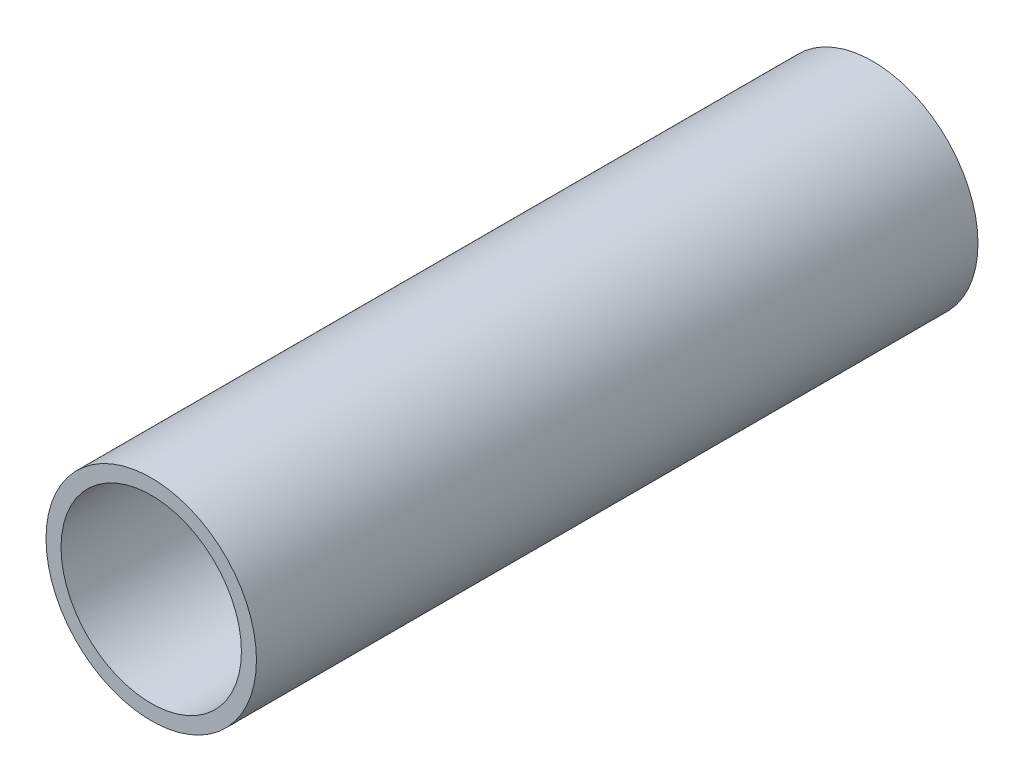
ISO-10303-21;
HEADER;
FILE_DESCRIPTION(('STEP AP214'),'2;1');
FILE_NAME('part.step','',(''),(''),'','','');
FILE_SCHEMA(('AUTOMOTIVE_DESIGN { 1 0 10303 214 1 1 1 1 }'));
ENDSEC;
DATA;
#1=APPLICATION_CONTEXT('core data for automotive mechanical design processes');
#2=APPLICATION_PROTOCOL_DEFINITION('international standard','automotive_design',2000,#1);
#3=PRODUCT_CONTEXT('',#1,'mechanical');
#4=PRODUCT('Part','Part','',(#3));
#5=PRODUCT_RELATED_PRODUCT_CATEGORY('part','',(#4));
#6=PRODUCT_DEFINITION_FORMATION('','',#4);
#7=PRODUCT_DEFINITION_CONTEXT('part definition',#1,'design');
#8=PRODUCT_DEFINITION('design','',#6,#7);
#9=PRODUCT_DEFINITION_SHAPE('','',#8);
#10=(LENGTH_UNIT() NAMED_UNIT(*) SI_UNIT(.MILLI.,.METRE.));
#11=(NAMED_UNIT(*) PLANE_ANGLE_UNIT() SI_UNIT($,.RADIAN.));
#12=(NAMED_UNIT(*) SI_UNIT($,.STERADIAN.) SOLID_ANGLE_UNIT());
#13=UNCERTAINTY_MEASURE_WITH_UNIT(LENGTH_MEASURE(1.E-05),#10,'distance_accuracy_value','');
#14=(GEOMETRIC_REPRESENTATION_CONTEXT(3) GLOBAL_UNCERTAINTY_ASSIGNED_CONTEXT((#13)) GLOBAL_UNIT_ASSIGNED_CONTEXT((#10,
#11,#12)) REPRESENTATION_CONTEXT('',''));
#15=CARTESIAN_POINT('',(0.,0.,0.));
#16=DIRECTION('',(0.,0.,1.));
#17=DIRECTION('',(1.,0.,0.));
#18=AXIS2_PLACEMENT_3D('',#15,#16,#17);
#19=CARTESIAN_POINT('',(0.,0.,152.4));
#20=DIRECTION('',(0.,0.,-1.));
#21=DIRECTION('',(-1.,0.,0.));
#22=AXIS2_PLACEMENT_3D('',#19,#20,#21);
#23=CYLINDRICAL_SURFACE('',#22,22.225);
#24=CARTESIAN_POINT('',(0.,0.,152.4));
#25=DIRECTION('',(0.,0.,1.));
#26=DIRECTION('',(1.,0.,0.));
#27=AXIS2_PLACEMENT_3D('',#24,#25,#26);
#28=CIRCLE('',#27,22.225);
#29=CARTESIAN_POINT('',(-22.225,0.,152.4));
#30=VERTEX_POINT('',#29);
#31=EDGE_CURVE('E10',#30,#30,#28,.T.);
#32=CARTESIAN_POINT('',(0.,0.,0.));
#33=DIRECTION('',(0.,0.,1.));
#34=DIRECTION('',(1.,0.,0.));
#35=AXIS2_PLACEMENT_3D('',#32,#33,#34);
#36=CIRCLE('',#35,22.225);
#37=CARTESIAN_POINT('',(-22.225,0.,0.));
#38=VERTEX_POINT('',#37);
#39=EDGE_CURVE('E40',#38,#38,#36,.T.);
#40=CARTESIAN_POINT('',(-22.225,0.,152.4));
#41=CARTESIAN_POINT('',(-22.225,0.,150.8125));
#42=CARTESIAN_POINT('',(-22.225,0.,149.225));
#43=CARTESIAN_POINT('',(-22.225,0.,146.05));
#44=CARTESIAN_POINT('',(-22.225,0.,144.4625));
#45=CARTESIAN_POINT('',(-22.225,0.,141.2875));
#46=CARTESIAN_POINT('',(-22.225,0.,139.7));
#47=CARTESIAN_POINT('',(-22.225,0.,136.525));
#48=CARTESIAN_POINT('',(-22.225,0.,134.9375));
#49=CARTESIAN_POINT('',(-22.225,0.,131.7625));
#50=CARTESIAN_POINT('',(-22.225,0.,130.175));
#51=CARTESIAN_POINT('',(-22.225,0.,127.));
#52=CARTESIAN_POINT('',(-22.225,0.,125.4125));
#53=CARTESIAN_POINT('',(-22.225,0.,122.2375));
#54=CARTESIAN_POINT('',(-22.225,0.,120.65));
#55=CARTESIAN_POINT('',(-22.225,0.,117.475));
#56=CARTESIAN_POINT('',(-22.225,0.,115.8875));
#57=CARTESIAN_POINT('',(-22.225,0.,112.7125));
#58=CARTESIAN_POINT('',(-22.225,0.,111.125));
#59=CARTESIAN_POINT('',(-22.225,0.,107.95));
#60=CARTESIAN_POINT('',(-22.225,0.,106.3625));
#61=CARTESIAN_POINT('',(-22.225,0.,103.1875));
#62=CARTESIAN_POINT('',(-22.225,0.,101.6));
#63=CARTESIAN_POINT('',(-22.225,0.,98.425));
#64=CARTESIAN_POINT('',(-22.225,0.,96.8375));
#65=CARTESIAN_POINT('',(-22.225,0.,93.6625));
#66=CARTESIAN_POINT('',(-22.225,0.,92.075));
#67=CARTESIAN_POINT('',(-22.225,0.,88.9));
#68=CARTESIAN_POINT('',(-22.225,0.,87.3125));
#69=CARTESIAN_POINT('',(-22.225,0.,84.1375));
#70=CARTESIAN_POINT('',(-22.225,0.,82.55));
#71=CARTESIAN_POINT('',(-22.225,0.,79.375));
#72=CARTESIAN_POINT('',(-22.225,0.,77.7875));
#73=CARTESIAN_POINT('',(-22.225,0.,74.6125));
#74=CARTESIAN_POINT('',(-22.225,0.,73.025));
#75=CARTESIAN_POINT('',(-22.225,0.,69.85));
#76=CARTESIAN_POINT('',(-22.225,0.,68.2625));
#77=CARTESIAN_POINT('',(-22.225,0.,65.0875));
#78=CARTESIAN_POINT('',(-22.225,0.,63.5));
#79=CARTESIAN_POINT('',(-22.225,0.,60.325));
#80=CARTESIAN_POINT('',(-22.225,0.,58.7375));
#81=CARTESIAN_POINT('',(-22.225,0.,55.5625));
#82=CARTESIAN_POINT('',(-22.225,0.,53.975));
#83=CARTESIAN_POINT('',(-22.225,0.,50.8));
#84=CARTESIAN_POINT('',(-22.225,0.,49.2125));
#85=CARTESIAN_POINT('',(-22.225,0.,46.0375));
#86=CARTESIAN_POINT('',(-22.225,0.,44.45));
#87=CARTESIAN_POINT('',(-22.225,0.,41.275));
#88=CARTESIAN_POINT('',(-22.225,0.,39.6875));
#89=CARTESIAN_POINT('',(-22.225,0.,36.5125));
#90=CARTESIAN_POINT('',(-22.225,0.,34.925));
#91=CARTESIAN_POINT('',(-22.225,0.,31.75));
#92=CARTESIAN_POINT('',(-22.225,0.,30.1625));
#93=CARTESIAN_POINT('',(-22.225,0.,26.9875));
#94=CARTESIAN_POINT('',(-22.225,0.,25.4));
#95=CARTESIAN_POINT('',(-22.225,0.,22.225));
#96=CARTESIAN_POINT('',(-22.225,0.,20.6375));
#97=CARTESIAN_POINT('',(-22.225,0.,17.4625));
#98=CARTESIAN_POINT('',(-22.225,0.,15.875));
#99=CARTESIAN_POINT('',(-22.225,0.,12.7));
#100=CARTESIAN_POINT('',(-22.225,0.,11.1125));
#101=CARTESIAN_POINT('',(-22.225,0.,7.93750000000001));
#102=CARTESIAN_POINT('',(-22.225,0.,6.35));
#103=CARTESIAN_POINT('',(-22.225,0.,3.175));
#104=CARTESIAN_POINT('',(-22.225,0.,1.5875));
#105=CARTESIAN_POINT('',(-22.225,0.,0.));
#106=B_SPLINE_CURVE_WITH_KNOTS('',3,(#40,#41,#42,#43,#44,#45,#46,#47,#48,#49,#50,#51,#52,#53,
#54,#55,#56,#57,#58,#59,#60,#61,#62,#63,#64,#65,#66,#67,#68,#69,#70,#71,#72,#73,#74,#75,#76,#77,
#78,#79,#80,#81,#82,#83,#84,#85,#86,#87,#88,#89,#90,#91,#92,#93,#94,#95,#96,#97,#98,#99,#100,
#101,#102,#103,#104,#105),.UNSPECIFIED.,.F.,.F.,(4,2,2,2,2,2,2,2,2,2,2,2,2,2,2,2,2,2,2,2,2,2,2,
2,2,2,2,2,2,2,2,2,4),(0.,4.76249999999998,9.52499999999998,14.2875,19.05,23.8125,28.575,33.3375,
38.1,42.8625,47.625,52.3875,57.15,61.9125,66.675,71.4375,76.2,80.9625,85.725,90.4875,95.25,
100.0125,104.775,109.5375,114.3,119.0625,123.825,128.5875,133.35,138.1125,142.875,147.6375,
152.4),.UNSPECIFIED.);
#107=EDGE_CURVE('BSEAM37',#30,#38,#106,.T.);
#108=ORIENTED_EDGE('',*,*,#31,.F.);
#109=ORIENTED_EDGE('',*,*,#39,.T.);
#110=ORIENTED_EDGE('',*,*,#107,.T.);
#111=ORIENTED_EDGE('',*,*,#107,.F.);
#112=EDGE_LOOP('',(#108,#110,#109,#111));
#113=FACE_BOUND('',#112,.T.);
#114=ADVANCED_FACE('F37',(#113),#23,.T.);
#115=CARTESIAN_POINT('',(0.,0.,152.4));
#116=DIRECTION('',(0.,0.,1.));
#117=DIRECTION('',(1.,0.,0.));
#118=AXIS2_PLACEMENT_3D('',#115,#116,#117);
#119=PLANE('',#118);
#120=CARTESIAN_POINT('',(0.,0.,152.4));
#121=DIRECTION('',(0.,0.,1.));
#122=DIRECTION('',(1.,0.,0.));
#123=AXIS2_PLACEMENT_3D('',#120,#121,#122);
#124=CIRCLE('',#123,19.05);
#125=CARTESIAN_POINT('',(19.05,0.,152.4));
#126=VERTEX_POINT('',#125);
#127=EDGE_CURVE('E49',#126,#126,#124,.T.);
#128=ORIENTED_EDGE('',*,*,#127,.F.);
#129=EDGE_LOOP('',(#128));
#130=FACE_BOUND('',#129,.T.);
#131=ORIENTED_EDGE('',*,*,#31,.T.);
#132=EDGE_LOOP('',(#131));
#133=FACE_BOUND('',#132,.T.);
#134=ADVANCED_FACE('F64',(#130,#133),#119,.T.);
#135=CARTESIAN_POINT('',(0.,0.,0.));
#136=DIRECTION('',(0.,0.,1.));
#137=DIRECTION('',(1.,0.,0.));
#138=AXIS2_PLACEMENT_3D('',#135,#136,#137);
#139=PLANE('',#138);
#140=CARTESIAN_POINT('',(0.,0.,0.));
#141=DIRECTION('',(0.,0.,1.));
#142=DIRECTION('',(1.,0.,0.));
#143=AXIS2_PLACEMENT_3D('',#140,#141,#142);
#144=CIRCLE('',#143,19.05);
#145=CARTESIAN_POINT('',(19.05,0.,0.));
#146=VERTEX_POINT('',#145);
#147=EDGE_CURVE('E47',#146,#146,#144,.T.);
#148=ORIENTED_EDGE('',*,*,#147,.T.);
#149=EDGE_LOOP('',(#148));
#150=FACE_BOUND('',#149,.T.);
#151=ORIENTED_EDGE('',*,*,#39,.F.);
#152=EDGE_LOOP('',(#151));
#153=FACE_BOUND('',#152,.T.);
#154=ADVANCED_FACE('F55',(#150,#153),#139,.F.);
#155=CARTESIAN_POINT('',(0.,0.,0.));
#156=DIRECTION('',(0.,0.,1.));
#157=DIRECTION('',(1.,0.,0.));
#158=AXIS2_PLACEMENT_3D('',#155,#156,#157);
#159=CYLINDRICAL_SURFACE('',#158,19.05);
#160=CARTESIAN_POINT('',(19.05,0.,0.));
#161=CARTESIAN_POINT('',(19.05,0.,1.5875));
#162=CARTESIAN_POINT('',(19.05,0.,3.175));
#163=CARTESIAN_POINT('',(19.05,0.,6.35));
#164=CARTESIAN_POINT('',(19.05,0.,7.9375));
#165=CARTESIAN_POINT('',(19.05,0.,11.1125));
#166=CARTESIAN_POINT('',(19.05,0.,12.7));
#167=CARTESIAN_POINT('',(19.05,0.,15.875));
#168=CARTESIAN_POINT('',(19.05,0.,17.4625));
#169=CARTESIAN_POINT('',(19.05,0.,20.6375));
#170=CARTESIAN_POINT('',(19.05,0.,22.225));
#171=CARTESIAN_POINT('',(19.05,0.,25.4));
#172=CARTESIAN_POINT('',(19.05,0.,26.9875));
#173=CARTESIAN_POINT('',(19.05,0.,30.1625));
#174=CARTESIAN_POINT('',(19.05,0.,31.75));
#175=CARTESIAN_POINT('',(19.05,0.,34.925));
#176=CARTESIAN_POINT('',(19.05,0.,36.5125));
#177=CARTESIAN_POINT('',(19.05,0.,39.6875));
#178=CARTESIAN_POINT('',(19.05,0.,41.275));
#179=CARTESIAN_POINT('',(19.05,0.,44.45));
#180=CARTESIAN_POINT('',(19.05,0.,46.0375));
#181=CARTESIAN_POINT('',(19.05,0.,49.2125));
#182=CARTESIAN_POINT('',(19.05,0.,50.8));
#183=CARTESIAN_POINT('',(19.05,0.,53.975));
#184=CARTESIAN_POINT('',(19.05,0.,55.5625));
#185=CARTESIAN_POINT('',(19.05,0.,58.7375));
#186=CARTESIAN_POINT('',(19.05,0.,60.325));
#187=CARTESIAN_POINT('',(19.05,0.,63.5));
#188=CARTESIAN_POINT('',(19.05,0.,65.0875));
#189=CARTESIAN_POINT('',(19.05,0.,68.2625));
#190=CARTESIAN_POINT('',(19.05,0.,69.85));
#191=CARTESIAN_POINT('',(19.05,0.,73.025));
#192=CARTESIAN_POINT('',(19.05,0.,74.6125));
#193=CARTESIAN_POINT('',(19.05,0.,77.7875));
#194=CARTESIAN_POINT('',(19.05,0.,79.375));
#195=CARTESIAN_POINT('',(19.05,0.,82.55));
#196=CARTESIAN_POINT('',(19.05,0.,84.1375));
#197=CARTESIAN_POINT('',(19.05,0.,87.3125));
#198=CARTESIAN_POINT('',(19.05,0.,88.9));
#199=CARTESIAN_POINT('',(19.05,0.,92.075));
#200=CARTESIAN_POINT('',(19.05,0.,93.6625));
#201=CARTESIAN_POINT('',(19.05,0.,96.8375));
#202=CARTESIAN_POINT('',(19.05,0.,98.425));
#203=CARTESIAN_POINT('',(19.05,0.,101.6));
#204=CARTESIAN_POINT('',(19.05,0.,103.1875));
#205=CARTESIAN_POINT('',(19.05,0.,106.3625));
#206=CARTESIAN_POINT('',(19.05,0.,107.95));
#207=CARTESIAN_POINT('',(19.05,0.,111.125));
#208=CARTESIAN_POINT('',(19.05,0.,112.7125));
#209=CARTESIAN_POINT('',(19.05,0.,115.8875));
#210=CARTESIAN_POINT('',(19.05,0.,117.475));
#211=CARTESIAN_POINT('',(19.05,0.,120.65));
#212=CARTESIAN_POINT('',(19.05,0.,122.2375));
#213=CARTESIAN_POINT('',(19.05,0.,125.4125));
#214=CARTESIAN_POINT('',(19.05,0.,127.));
#215=CARTESIAN_POINT('',(19.05,0.,130.175));
#216=CARTESIAN_POINT('',(19.05,0.,131.7625));
#217=CARTESIAN_POINT('',(19.05,0.,134.9375));
#218=CARTESIAN_POINT('',(19.05,0.,136.525));
#219=CARTESIAN_POINT('',(19.05,0.,139.7));
#220=CARTESIAN_POINT('',(19.05,0.,141.2875));
#221=CARTESIAN_POINT('',(19.05,0.,144.4625));
#222=CARTESIAN_POINT('',(19.05,0.,146.05));
#223=CARTESIAN_POINT('',(19.05,0.,149.225));
#224=CARTESIAN_POINT('',(19.05,0.,150.8125));
#225=CARTESIAN_POINT('',(19.05,0.,152.4));
#226=B_SPLINE_CURVE_WITH_KNOTS('',3,(#160,#161,#162,#163,#164,#165,#166,#167,#168,#169,#170,
#171,#172,#173,#174,#175,#176,#177,#178,#179,#180,#181,#182,#183,#184,#185,#186,#187,#188,#189,
#190,#191,#192,#193,#194,#195,#196,#197,#198,#199,#200,#201,#202,#203,#204,#205,#206,#207,#208,
#209,#210,#211,#212,#213,#214,#215,#216,#217,#218,#219,#220,#221,#222,#223,#224,#225),
.UNSPECIFIED.,.F.,.F.,(4,2,2,2,2,2,2,2,2,2,2,2,2,2,2,2,2,2,2,2,2,2,2,2,2,2,2,2,2,2,2,2,4),(0.,
4.7625,9.525,14.2875,19.05,23.8125,28.575,33.3375,38.1,42.8625,47.625,52.3875,57.15,61.9125,
66.675,71.4375,76.2,80.9625,85.725,90.4875,95.25,100.0125,104.775,109.5375,114.3,119.0625,
123.825,128.5875,133.35,138.1125,142.875,147.6375,152.4),.UNSPECIFIED.);
#227=EDGE_CURVE('BSEAM58',#146,#126,#226,.T.);
#228=ORIENTED_EDGE('',*,*,#147,.F.);
#229=ORIENTED_EDGE('',*,*,#127,.T.);
#230=ORIENTED_EDGE('',*,*,#227,.T.);
#231=ORIENTED_EDGE('',*,*,#227,.F.);
#232=EDGE_LOOP('',(#228,#230,#229,#231));
#233=FACE_BOUND('',#232,.T.);
#234=ADVANCED_FACE('F58',(#233),#159,.F.);
#235=CLOSED_SHELL('',(#114,#134,#154,#234));
#236=MANIFOLD_SOLID_BREP('B2',#235);
#237=ADVANCED_BREP_SHAPE_REPRESENTATION('',(#18,#236),#14);
#238=SHAPE_DEFINITION_REPRESENTATION(#9,#237);
ENDSEC;
END-ISO-10303-21;
